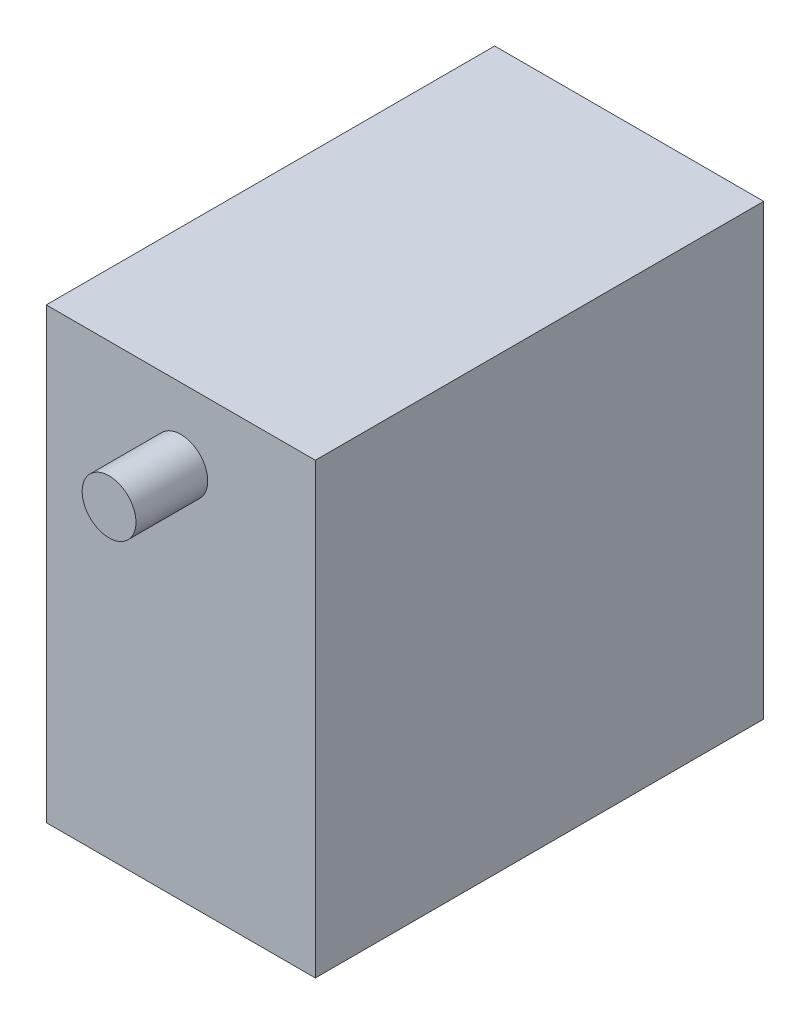
ISO-10303-21;
HEADER;
FILE_DESCRIPTION(('STEP AP214'),'2;1');
FILE_NAME('part.step','',(''),(''),'','','');
FILE_SCHEMA(('AUTOMOTIVE_DESIGN { 1 0 10303 214 1 1 1 1 }'));
ENDSEC;
DATA;
#1=APPLICATION_CONTEXT('core data for automotive mechanical design processes');
#2=APPLICATION_PROTOCOL_DEFINITION('international standard','automotive_design',2000,#1);
#3=PRODUCT_CONTEXT('',#1,'mechanical');
#4=PRODUCT('Part','Part','',(#3));
#5=PRODUCT_RELATED_PRODUCT_CATEGORY('part','',(#4));
#6=PRODUCT_DEFINITION_FORMATION('','',#4);
#7=PRODUCT_DEFINITION_CONTEXT('part definition',#1,'design');
#8=PRODUCT_DEFINITION('design','',#6,#7);
#9=PRODUCT_DEFINITION_SHAPE('','',#8);
#10=(LENGTH_UNIT() NAMED_UNIT(*) SI_UNIT(.MILLI.,.METRE.));
#11=(NAMED_UNIT(*) PLANE_ANGLE_UNIT() SI_UNIT($,.RADIAN.));
#12=(NAMED_UNIT(*) SI_UNIT($,.STERADIAN.) SOLID_ANGLE_UNIT());
#13=UNCERTAINTY_MEASURE_WITH_UNIT(LENGTH_MEASURE(1.E-05),#10,'distance_accuracy_value','');
#14=(GEOMETRIC_REPRESENTATION_CONTEXT(3) GLOBAL_UNCERTAINTY_ASSIGNED_CONTEXT((#13)) GLOBAL_UNIT_ASSIGNED_CONTEXT((#10,
#11,#12)) REPRESENTATION_CONTEXT('',''));
#15=CARTESIAN_POINT('',(0.,0.,0.));
#16=DIRECTION('',(0.,0.,1.));
#17=DIRECTION('',(1.,0.,0.));
#18=AXIS2_PLACEMENT_3D('',#15,#16,#17);
#19=CARTESIAN_POINT('',(0.,0.,50.));
#20=DIRECTION('',(0.,0.,-1.));
#21=DIRECTION('',(-1.,0.,0.));
#22=AXIS2_PLACEMENT_3D('',#19,#20,#21);
#23=PLANE('',#22);
#24=DIRECTION('',(0.,1.,0.));
#25=VECTOR('',#24,1.);
#26=CARTESIAN_POINT('',(15.,-25.,50.));
#27=LINE('',#26,#25);
#28=CARTESIAN_POINT('',(15.,-25.,50.));
#29=VERTEX_POINT('',#28);
#30=CARTESIAN_POINT('',(15.,25.,50.));
#31=VERTEX_POINT('',#30);
#32=EDGE_CURVE('E88',#29,#31,#27,.T.);
#33=ORIENTED_EDGE('',*,*,#32,.T.);
#34=DIRECTION('',(-1.,0.,0.));
#35=VECTOR('',#34,1.);
#36=CARTESIAN_POINT('',(-15.,25.,50.));
#37=LINE('',#36,#35);
#38=CARTESIAN_POINT('',(-15.,25.,50.));
#39=VERTEX_POINT('',#38);
#40=EDGE_CURVE('E83',#31,#39,#37,.T.);
#41=ORIENTED_EDGE('',*,*,#40,.T.);
#42=DIRECTION('',(0.,-1.,0.));
#43=VECTOR('',#42,1.);
#44=CARTESIAN_POINT('',(-15.,-25.,50.));
#45=LINE('',#44,#43);
#46=CARTESIAN_POINT('',(-15.,-25.,50.));
#47=VERTEX_POINT('',#46);
#48=EDGE_CURVE('E86',#39,#47,#45,.T.);
#49=ORIENTED_EDGE('',*,*,#48,.T.);
#50=DIRECTION('',(1.,0.,0.));
#51=VECTOR('',#50,1.);
#52=CARTESIAN_POINT('',(-15.,-25.,50.));
#53=LINE('',#52,#51);
#54=EDGE_CURVE('E52',#47,#29,#53,.T.);
#55=ORIENTED_EDGE('',*,*,#54,.T.);
#56=EDGE_LOOP('',(#33,#41,#49,#55));
#57=FACE_BOUND('',#56,.T.);
#58=CARTESIAN_POINT('',(0.,17.,50.));
#59=DIRECTION('',(0.,0.,-1.));
#60=DIRECTION('',(-1.,0.,0.));
#61=AXIS2_PLACEMENT_3D('',#58,#59,#60);
#62=CIRCLE('',#61,3.);
#63=CARTESIAN_POINT('',(-3.,17.,50.));
#64=VERTEX_POINT('',#63);
#65=EDGE_CURVE('E11',#64,#64,#62,.F.);
#66=ORIENTED_EDGE('',*,*,#65,.F.);
#67=EDGE_LOOP('',(#66));
#68=FACE_BOUND('',#67,.T.);
#69=ADVANCED_FACE('F35',(#57,#68),#23,.F.);
#70=CARTESIAN_POINT('',(15.,-25.,50.));
#71=DIRECTION('',(-1.,0.,0.));
#72=DIRECTION('',(0.,0.,1.));
#73=AXIS2_PLACEMENT_3D('',#70,#71,#72);
#74=PLANE('',#73);
#75=DIRECTION('',(0.,1.,0.));
#76=VECTOR('',#75,1.);
#77=CARTESIAN_POINT('',(15.,-25.,0.));
#78=LINE('',#77,#76);
#79=CARTESIAN_POINT('',(15.,-25.,0.));
#80=VERTEX_POINT('',#79);
#81=CARTESIAN_POINT('',(15.,25.,0.));
#82=VERTEX_POINT('',#81);
#83=EDGE_CURVE('E102',#80,#82,#78,.T.);
#84=ORIENTED_EDGE('',*,*,#83,.T.);
#85=DIRECTION('',(0.,0.,-1.));
#86=VECTOR('',#85,1.);
#87=CARTESIAN_POINT('',(15.,25.,50.));
#88=LINE('',#87,#86);
#89=EDGE_CURVE('E44',#31,#82,#88,.T.);
#90=ORIENTED_EDGE('',*,*,#89,.F.);
#91=ORIENTED_EDGE('',*,*,#32,.F.);
#92=DIRECTION('',(0.,0.,-1.));
#93=VECTOR('',#92,1.);
#94=CARTESIAN_POINT('',(15.,-25.,50.));
#95=LINE('',#94,#93);
#96=EDGE_CURVE('E98',#29,#80,#95,.T.);
#97=ORIENTED_EDGE('',*,*,#96,.T.);
#98=EDGE_LOOP('',(#84,#90,#91,#97));
#99=FACE_BOUND('',#98,.T.);
#100=ADVANCED_FACE('F37',(#99),#74,.F.);
#101=CARTESIAN_POINT('',(-15.,25.,50.));
#102=DIRECTION('',(0.,-1.,0.));
#103=DIRECTION('',(0.,0.,-1.));
#104=AXIS2_PLACEMENT_3D('',#101,#102,#103);
#105=PLANE('',#104);
#106=DIRECTION('',(-1.,0.,0.));
#107=VECTOR('',#106,1.);
#108=CARTESIAN_POINT('',(-15.,25.,0.));
#109=LINE('',#108,#107);
#110=CARTESIAN_POINT('',(-15.,25.,0.));
#111=VERTEX_POINT('',#110);
#112=EDGE_CURVE('E93',#82,#111,#109,.T.);
#113=ORIENTED_EDGE('',*,*,#112,.T.);
#114=DIRECTION('',(0.,0.,-1.));
#115=VECTOR('',#114,1.);
#116=CARTESIAN_POINT('',(-15.,25.,50.));
#117=LINE('',#116,#115);
#118=EDGE_CURVE('E91',#39,#111,#117,.T.);
#119=ORIENTED_EDGE('',*,*,#118,.F.);
#120=ORIENTED_EDGE('',*,*,#40,.F.);
#121=ORIENTED_EDGE('',*,*,#89,.T.);
#122=EDGE_LOOP('',(#113,#119,#120,#121));
#123=FACE_BOUND('',#122,.T.);
#124=ADVANCED_FACE('F92',(#123),#105,.F.);
#125=CARTESIAN_POINT('',(-15.,-25.,50.));
#126=DIRECTION('',(1.,0.,0.));
#127=DIRECTION('',(0.,0.,-1.));
#128=AXIS2_PLACEMENT_3D('',#125,#126,#127);
#129=PLANE('',#128);
#130=DIRECTION('',(0.,-1.,0.));
#131=VECTOR('',#130,1.);
#132=CARTESIAN_POINT('',(-15.,-25.,0.));
#133=LINE('',#132,#131);
#134=CARTESIAN_POINT('',(-15.,-25.,0.));
#135=VERTEX_POINT('',#134);
#136=EDGE_CURVE('E69',#111,#135,#133,.T.);
#137=ORIENTED_EDGE('',*,*,#136,.T.);
#138=DIRECTION('',(0.,0.,-1.));
#139=VECTOR('',#138,1.);
#140=CARTESIAN_POINT('',(-15.,-25.,50.));
#141=LINE('',#140,#139);
#142=EDGE_CURVE('E94',#47,#135,#141,.T.);
#143=ORIENTED_EDGE('',*,*,#142,.F.);
#144=ORIENTED_EDGE('',*,*,#48,.F.);
#145=ORIENTED_EDGE('',*,*,#118,.T.);
#146=EDGE_LOOP('',(#137,#143,#144,#145));
#147=FACE_BOUND('',#146,.T.);
#148=ADVANCED_FACE('F96',(#147),#129,.F.);
#149=CARTESIAN_POINT('',(-15.,-25.,50.));
#150=DIRECTION('',(0.,1.,0.));
#151=DIRECTION('',(0.,0.,1.));
#152=AXIS2_PLACEMENT_3D('',#149,#150,#151);
#153=PLANE('',#152);
#154=DIRECTION('',(1.,0.,0.));
#155=VECTOR('',#154,1.);
#156=CARTESIAN_POINT('',(-15.,-25.,0.));
#157=LINE('',#156,#155);
#158=EDGE_CURVE('E75',#135,#80,#157,.T.);
#159=ORIENTED_EDGE('',*,*,#158,.T.);
#160=ORIENTED_EDGE('',*,*,#96,.F.);
#161=ORIENTED_EDGE('',*,*,#54,.F.);
#162=ORIENTED_EDGE('',*,*,#142,.T.);
#163=EDGE_LOOP('',(#159,#160,#161,#162));
#164=FACE_BOUND('',#163,.T.);
#165=ADVANCED_FACE('F116',(#164),#153,.F.);
#166=CARTESIAN_POINT('',(0.,0.,0.));
#167=DIRECTION('',(0.,0.,-1.));
#168=DIRECTION('',(-1.,0.,0.));
#169=AXIS2_PLACEMENT_3D('',#166,#167,#168);
#170=PLANE('',#169);
#171=ORIENTED_EDGE('',*,*,#83,.F.);
#172=ORIENTED_EDGE('',*,*,#158,.F.);
#173=ORIENTED_EDGE('',*,*,#136,.F.);
#174=ORIENTED_EDGE('',*,*,#112,.F.);
#175=EDGE_LOOP('',(#171,#172,#173,#174));
#176=FACE_BOUND('',#175,.T.);
#177=ADVANCED_FACE('F113',(#176),#170,.T.);
#178=CARTESIAN_POINT('',(0.,17.,58.));
#179=DIRECTION('',(0.,0.,-1.));
#180=DIRECTION('',(-1.,0.,0.));
#181=AXIS2_PLACEMENT_3D('',#178,#179,#180);
#182=CYLINDRICAL_SURFACE('',#181,3.);
#183=CARTESIAN_POINT('',(0.,17.,58.));
#184=DIRECTION('',(0.,0.,1.));
#185=DIRECTION('',(1.,0.,0.));
#186=AXIS2_PLACEMENT_3D('',#183,#184,#185);
#187=CIRCLE('',#186,3.);
#188=CARTESIAN_POINT('',(3.,17.,58.));
#189=VERTEX_POINT('',#188);
#190=EDGE_CURVE('E105',#189,#189,#187,.T.);
#191=ORIENTED_EDGE('',*,*,#190,.F.);
#192=EDGE_LOOP('',(#191));
#193=FACE_BOUND('',#192,.T.);
#194=ORIENTED_EDGE('',*,*,#65,.T.);
#195=EDGE_LOOP('',(#194));
#196=FACE_BOUND('',#195,.T.);
#197=ADVANCED_FACE('F115',(#193,#196),#182,.T.);
#198=CARTESIAN_POINT('',(0.,17.,58.));
#199=DIRECTION('',(0.,0.,1.));
#200=DIRECTION('',(1.,0.,0.));
#201=AXIS2_PLACEMENT_3D('',#198,#199,#200);
#202=PLANE('',#201);
#203=ORIENTED_EDGE('',*,*,#190,.T.);
#204=EDGE_LOOP('',(#203));
#205=FACE_BOUND('',#204,.T.);
#206=ADVANCED_FACE('F122',(#205),#202,.T.);
#207=CLOSED_SHELL('',(#69,#100,#124,#148,#165,#177,#197,#206));
#208=MANIFOLD_SOLID_BREP('B2',#207);
#209=ADVANCED_BREP_SHAPE_REPRESENTATION('',(#18,#208),#14);
#210=SHAPE_DEFINITION_REPRESENTATION(#9,#209);
ENDSEC;
END-ISO-10303-21;
